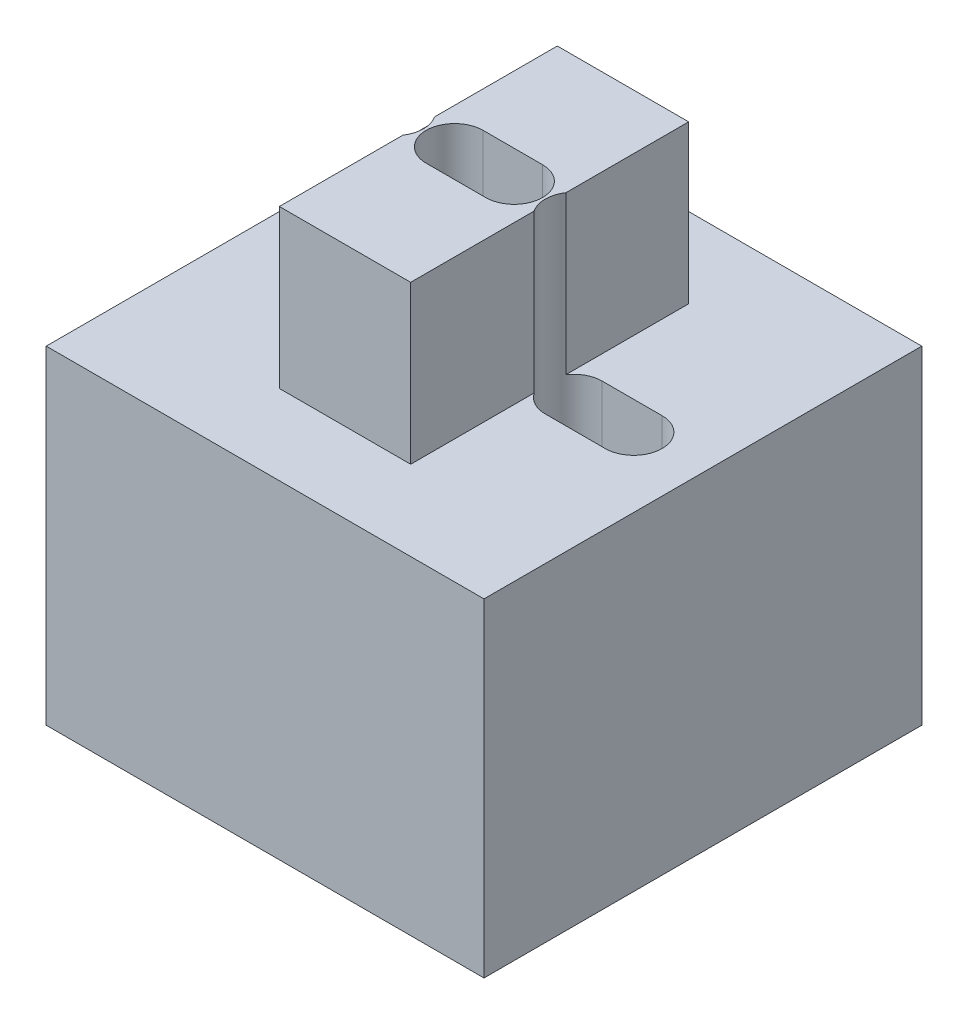
ISO-10303-21;
HEADER;
FILE_DESCRIPTION(('STEP AP214'),'2;1');
FILE_NAME('part.step','',(''),(''),'','','');
FILE_SCHEMA(('AUTOMOTIVE_DESIGN { 1 0 10303 214 1 1 1 1 }'));
ENDSEC;
DATA;
#1=APPLICATION_CONTEXT('core data for automotive mechanical design processes');
#2=APPLICATION_PROTOCOL_DEFINITION('international standard','automotive_design',2000,#1);
#3=PRODUCT_CONTEXT('',#1,'mechanical');
#4=PRODUCT('Part','Part','',(#3));
#5=PRODUCT_RELATED_PRODUCT_CATEGORY('part','',(#4));
#6=PRODUCT_DEFINITION_FORMATION('','',#4);
#7=PRODUCT_DEFINITION_CONTEXT('part definition',#1,'design');
#8=PRODUCT_DEFINITION('design','',#6,#7);
#9=PRODUCT_DEFINITION_SHAPE('','',#8);
#10=(LENGTH_UNIT() NAMED_UNIT(*) SI_UNIT(.MILLI.,.METRE.));
#11=(NAMED_UNIT(*) PLANE_ANGLE_UNIT() SI_UNIT($,.RADIAN.));
#12=(NAMED_UNIT(*) SI_UNIT($,.STERADIAN.) SOLID_ANGLE_UNIT());
#13=UNCERTAINTY_MEASURE_WITH_UNIT(LENGTH_MEASURE(1.E-05),#10,'distance_accuracy_value','');
#14=(GEOMETRIC_REPRESENTATION_CONTEXT(3) GLOBAL_UNCERTAINTY_ASSIGNED_CONTEXT((#13)) GLOBAL_UNIT_ASSIGNED_CONTEXT((#10,
#11,#12)) REPRESENTATION_CONTEXT('',''));
#15=CARTESIAN_POINT('',(0.,0.,0.));
#16=DIRECTION('',(0.,0.,1.));
#17=DIRECTION('',(1.,0.,0.));
#18=AXIS2_PLACEMENT_3D('',#15,#16,#17);
#19=CARTESIAN_POINT('',(-2.18,11.1,-3.16624798998755));
#20=DIRECTION('',(1.,0.,0.));
#21=DIRECTION('',(0.,0.,-1.));
#22=AXIS2_PLACEMENT_3D('',#19,#20,#21);
#23=PLANE('',#22);
#24=DIRECTION('',(0.,0.,1.));
#25=VECTOR('',#24,1.);
#26=CARTESIAN_POINT('',(-2.18,7.5,-3.16624798998755));
#27=LINE('',#26,#25);
#28=CARTESIAN_POINT('',(-2.18,7.5,-3.16624798998755));
#29=VERTEX_POINT('',#28);
#30=CARTESIAN_POINT('',(-2.18,7.5,-0.36180105030251));
#31=VERTEX_POINT('',#30);
#32=EDGE_CURVE('E332',#29,#31,#27,.T.);
#33=ORIENTED_EDGE('',*,*,#32,.T.);
#34=DIRECTION('',(0.,1.,0.));
#35=VECTOR('',#34,1.);
#36=CARTESIAN_POINT('',(-2.18,0.,-0.36180105030251));
#37=LINE('',#36,#35);
#38=CARTESIAN_POINT('',(-2.18,11.1,-0.36180105030251));
#39=VERTEX_POINT('',#38);
#40=EDGE_CURVE('E271',#31,#39,#37,.T.);
#41=ORIENTED_EDGE('',*,*,#40,.T.);
#42=DIRECTION('',(0.,0.,1.));
#43=VECTOR('',#42,1.);
#44=CARTESIAN_POINT('',(-2.18,11.1,-3.16624798998755));
#45=LINE('',#44,#43);
#46=CARTESIAN_POINT('',(-2.18,11.1,-3.16624798998755));
#47=VERTEX_POINT('',#46);
#48=EDGE_CURVE('E319',#47,#39,#45,.T.);
#49=ORIENTED_EDGE('',*,*,#48,.F.);
#50=DIRECTION('',(0.,-1.,0.));
#51=VECTOR('',#50,1.);
#52=CARTESIAN_POINT('',(-2.18,11.1,-3.16624798998755));
#53=LINE('',#52,#51);
#54=EDGE_CURVE('E349',#47,#29,#53,.T.);
#55=ORIENTED_EDGE('',*,*,#54,.T.);
#56=EDGE_LOOP('',(#33,#41,#49,#55));
#57=FACE_BOUND('',#56,.T.);
#58=ADVANCED_FACE('F39',(#57),#23,.F.);
#59=CARTESIAN_POINT('',(0.82,11.1,-3.16624798998755));
#60=DIRECTION('',(-1.,0.,0.));
#61=DIRECTION('',(0.,0.,1.));
#62=AXIS2_PLACEMENT_3D('',#59,#60,#61);
#63=PLANE('',#62);
#64=DIRECTION('',(0.,0.,-1.));
#65=VECTOR('',#64,1.);
#66=CARTESIAN_POINT('',(0.82,7.5,-3.16624798998755));
#67=LINE('',#66,#65);
#68=CARTESIAN_POINT('',(0.82,7.5,3.18277167192382));
#69=VERTEX_POINT('',#68);
#70=CARTESIAN_POINT('',(0.82,7.5,0.361801050302511));
#71=VERTEX_POINT('',#70);
#72=EDGE_CURVE('E318',#69,#71,#67,.T.);
#73=ORIENTED_EDGE('',*,*,#72,.T.);
#74=DIRECTION('',(0.,1.,0.));
#75=VECTOR('',#74,1.);
#76=CARTESIAN_POINT('',(0.82,0.,0.361801050302511));
#77=LINE('',#76,#75);
#78=CARTESIAN_POINT('',(0.82,11.1,0.361801050302511));
#79=VERTEX_POINT('',#78);
#80=EDGE_CURVE('E261',#71,#79,#77,.T.);
#81=ORIENTED_EDGE('',*,*,#80,.T.);
#82=DIRECTION('',(0.,0.,-1.));
#83=VECTOR('',#82,1.);
#84=CARTESIAN_POINT('',(0.82,11.1,-3.16624798998755));
#85=LINE('',#84,#83);
#86=CARTESIAN_POINT('',(0.82,11.1,3.18277167192382));
#87=VERTEX_POINT('',#86);
#88=EDGE_CURVE('E325',#87,#79,#85,.T.);
#89=ORIENTED_EDGE('',*,*,#88,.F.);
#90=DIRECTION('',(0.,-1.,0.));
#91=VECTOR('',#90,1.);
#92=CARTESIAN_POINT('',(0.82,11.1,3.18277167192382));
#93=LINE('',#92,#91);
#94=EDGE_CURVE('E343',#87,#69,#93,.T.);
#95=ORIENTED_EDGE('',*,*,#94,.T.);
#96=EDGE_LOOP('',(#73,#81,#89,#95));
#97=FACE_BOUND('',#96,.T.);
#98=ADVANCED_FACE('F426',(#97),#63,.F.);
#99=CARTESIAN_POINT('',(0.,7.5,0.));
#100=DIRECTION('',(0.,-1.,0.));
#101=DIRECTION('',(0.,0.,-1.));
#102=AXIS2_PLACEMENT_3D('',#99,#100,#101);
#103=PLANE('',#102);
#104=DIRECTION('',(0.,0.,-1.));
#105=VECTOR('',#104,1.);
#106=CARTESIAN_POINT('',(4.32,7.5,5.00826184096814));
#107=LINE('',#106,#105);
#108=CARTESIAN_POINT('',(4.32,7.5,5.00826184096814));
#109=VERTEX_POINT('',#108);
#110=CARTESIAN_POINT('',(4.32,7.5,-4.99173815903186));
#111=VERTEX_POINT('',#110);
#112=EDGE_CURVE('E353',#109,#111,#107,.T.);
#113=ORIENTED_EDGE('',*,*,#112,.T.);
#114=DIRECTION('',(-1.,0.,0.));
#115=VECTOR('',#114,1.);
#116=CARTESIAN_POINT('',(-5.68,7.5,-4.99173815903186));
#117=LINE('',#116,#115);
#118=CARTESIAN_POINT('',(-5.68,7.5,-4.99173815903186));
#119=VERTEX_POINT('',#118);
#120=EDGE_CURVE('E356',#111,#119,#117,.T.);
#121=ORIENTED_EDGE('',*,*,#120,.T.);
#122=DIRECTION('',(0.,0.,1.));
#123=VECTOR('',#122,1.);
#124=CARTESIAN_POINT('',(-5.68,7.5,5.00826184096814));
#125=LINE('',#124,#123);
#126=CARTESIAN_POINT('',(-5.68,7.5,5.00826184096814));
#127=VERTEX_POINT('',#126);
#128=EDGE_CURVE('E359',#119,#127,#125,.T.);
#129=ORIENTED_EDGE('',*,*,#128,.T.);
#130=DIRECTION('',(1.,0.,0.));
#131=VECTOR('',#130,1.);
#132=CARTESIAN_POINT('',(-5.68,7.5,5.00826184096814));
#133=LINE('',#132,#131);
#134=EDGE_CURVE('E361',#127,#109,#133,.T.);
#135=ORIENTED_EDGE('',*,*,#134,.T.);
#136=EDGE_LOOP('',(#113,#121,#129,#135));
#137=FACE_BOUND('',#136,.T.);
#138=DIRECTION('',(1.,0.,0.));
#139=VECTOR('',#138,1.);
#140=CARTESIAN_POINT('',(0.,7.5,-0.65));
#141=LINE('',#140,#139);
#142=CARTESIAN_POINT('',(-4.14643165672213,7.5,-0.65));
#143=VERTEX_POINT('',#142);
#144=CARTESIAN_POINT('',(-2.72,7.5,-0.65));
#145=VERTEX_POINT('',#144);
#146=EDGE_CURVE('E286',#143,#145,#141,.T.);
#147=ORIENTED_EDGE('',*,*,#146,.T.);
#148=CARTESIAN_POINT('',(-2.72,7.5,0.));
#149=DIRECTION('',(0.,-1.,0.));
#150=DIRECTION('',(0.,0.,-1.));
#151=AXIS2_PLACEMENT_3D('',#148,#149,#150);
#152=CIRCLE('',#151,0.65);
#153=EDGE_CURVE('E272',#145,#31,#152,.T.);
#154=ORIENTED_EDGE('',*,*,#153,.T.);
#155=ORIENTED_EDGE('',*,*,#32,.F.);
#156=DIRECTION('',(-1.,0.,0.));
#157=VECTOR('',#156,1.);
#158=CARTESIAN_POINT('',(-2.18,7.5,-3.16624798998755));
#159=LINE('',#158,#157);
#160=CARTESIAN_POINT('',(0.82,7.5,-3.16624798998755));
#161=VERTEX_POINT('',#160);
#162=EDGE_CURVE('E310',#161,#29,#159,.T.);
#163=ORIENTED_EDGE('',*,*,#162,.F.);
#164=CARTESIAN_POINT('',(0.82,7.5,-0.361801050302511));
#165=VERTEX_POINT('',#164);
#166=EDGE_CURVE('E338',#165,#161,#67,.T.);
#167=ORIENTED_EDGE('',*,*,#166,.F.);
#168=CARTESIAN_POINT('',(1.36,7.5,0.));
#169=DIRECTION('',(0.,-1.,0.));
#170=DIRECTION('',(0.,0.,-1.));
#171=AXIS2_PLACEMENT_3D('',#168,#169,#170);
#172=CIRCLE('',#171,0.65);
#173=CARTESIAN_POINT('',(1.36,7.5,-0.65));
#174=VERTEX_POINT('',#173);
#175=EDGE_CURVE('E258',#165,#174,#172,.T.);
#176=ORIENTED_EDGE('',*,*,#175,.T.);
#177=DIRECTION('',(1.,0.,0.));
#178=VECTOR('',#177,1.);
#179=CARTESIAN_POINT('',(0.,7.5,-0.65));
#180=LINE('',#179,#178);
#181=CARTESIAN_POINT('',(2.73028057354652,7.5,-0.65));
#182=VERTEX_POINT('',#181);
#183=EDGE_CURVE('E275',#174,#182,#180,.T.);
#184=ORIENTED_EDGE('',*,*,#183,.T.);
#185=CARTESIAN_POINT('',(2.73028057354652,7.5,0.));
#186=DIRECTION('',(0.,-1.,0.));
#187=DIRECTION('',(0.,0.,-1.));
#188=AXIS2_PLACEMENT_3D('',#185,#186,#187);
#189=CIRCLE('',#188,0.65);
#190=CARTESIAN_POINT('',(2.73028057354652,7.5,0.65));
#191=VERTEX_POINT('',#190);
#192=EDGE_CURVE('E281',#182,#191,#189,.T.);
#193=ORIENTED_EDGE('',*,*,#192,.T.);
#194=DIRECTION('',(-1.,0.,0.));
#195=VECTOR('',#194,1.);
#196=CARTESIAN_POINT('',(0.,7.5,0.65));
#197=LINE('',#196,#195);
#198=CARTESIAN_POINT('',(1.36,7.5,0.65));
#199=VERTEX_POINT('',#198);
#200=EDGE_CURVE('E278',#191,#199,#197,.T.);
#201=ORIENTED_EDGE('',*,*,#200,.T.);
#202=EDGE_CURVE('E262',#199,#71,#172,.T.);
#203=ORIENTED_EDGE('',*,*,#202,.T.);
#204=ORIENTED_EDGE('',*,*,#72,.F.);
#205=DIRECTION('',(1.,0.,0.));
#206=VECTOR('',#205,1.);
#207=CARTESIAN_POINT('',(0.82,7.5,3.18277167192382));
#208=LINE('',#207,#206);
#209=CARTESIAN_POINT('',(-2.18,7.5,3.18277167192382));
#210=VERTEX_POINT('',#209);
#211=EDGE_CURVE('E335',#210,#69,#208,.T.);
#212=ORIENTED_EDGE('',*,*,#211,.F.);
#213=CARTESIAN_POINT('',(-2.18,7.5,0.36180105030251));
#214=VERTEX_POINT('',#213);
#215=EDGE_CURVE('E331',#214,#210,#27,.T.);
#216=ORIENTED_EDGE('',*,*,#215,.F.);
#217=CARTESIAN_POINT('',(-2.72,7.5,0.65));
#218=VERTEX_POINT('',#217);
#219=EDGE_CURVE('E268',#214,#218,#152,.T.);
#220=ORIENTED_EDGE('',*,*,#219,.T.);
#221=DIRECTION('',(-1.,0.,0.));
#222=VECTOR('',#221,1.);
#223=CARTESIAN_POINT('',(0.,7.5,0.65));
#224=LINE('',#223,#222);
#225=CARTESIAN_POINT('',(-4.14643165672213,7.5,0.65));
#226=VERTEX_POINT('',#225);
#227=EDGE_CURVE('E284',#218,#226,#224,.T.);
#228=ORIENTED_EDGE('',*,*,#227,.T.);
#229=CARTESIAN_POINT('',(-4.14643165672213,7.5,0.));
#230=DIRECTION('',(0.,-1.,0.));
#231=DIRECTION('',(0.,0.,-1.));
#232=AXIS2_PLACEMENT_3D('',#229,#230,#231);
#233=CIRCLE('',#232,0.65);
#234=EDGE_CURVE('E210',#226,#143,#233,.T.);
#235=ORIENTED_EDGE('',*,*,#234,.T.);
#236=EDGE_LOOP('',(#147,#154,#155,#163,#167,#176,#184,#193,#201,#203,#204,#212,#216,#220,#228,#235));
#237=FACE_BOUND('',#236,.T.);
#238=ADVANCED_FACE('F412',(#137,#237),#103,.F.);
#239=CARTESIAN_POINT('',(4.32,7.5,5.00826184096814));
#240=DIRECTION('',(-1.,0.,0.));
#241=DIRECTION('',(0.,0.,1.));
#242=AXIS2_PLACEMENT_3D('',#239,#240,#241);
#243=PLANE('',#242);
#244=DIRECTION('',(0.,0.,-1.));
#245=VECTOR('',#244,1.);
#246=CARTESIAN_POINT('',(4.32,0.,5.00826184096814));
#247=LINE('',#246,#245);
#248=CARTESIAN_POINT('',(4.32,0.,5.00826184096814));
#249=VERTEX_POINT('',#248);
#250=CARTESIAN_POINT('',(4.32,0.,-4.99173815903186));
#251=VERTEX_POINT('',#250);
#252=EDGE_CURVE('E352',#249,#251,#247,.T.);
#253=ORIENTED_EDGE('',*,*,#252,.T.);
#254=DIRECTION('',(0.,-1.,0.));
#255=VECTOR('',#254,1.);
#256=CARTESIAN_POINT('',(4.32,7.5,-4.99173815903186));
#257=LINE('',#256,#255);
#258=EDGE_CURVE('E379',#111,#251,#257,.T.);
#259=ORIENTED_EDGE('',*,*,#258,.F.);
#260=ORIENTED_EDGE('',*,*,#112,.F.);
#261=DIRECTION('',(0.,-1.,0.));
#262=VECTOR('',#261,1.);
#263=CARTESIAN_POINT('',(4.32,7.5,5.00826184096814));
#264=LINE('',#263,#262);
#265=EDGE_CURVE('E363',#109,#249,#264,.T.);
#266=ORIENTED_EDGE('',*,*,#265,.T.);
#267=EDGE_LOOP('',(#253,#259,#260,#266));
#268=FACE_BOUND('',#267,.T.);
#269=ADVANCED_FACE('F41',(#268),#243,.F.);
#270=CARTESIAN_POINT('',(-5.68,7.5,-4.99173815903186));
#271=DIRECTION('',(0.,0.,1.));
#272=DIRECTION('',(1.,0.,0.));
#273=AXIS2_PLACEMENT_3D('',#270,#271,#272);
#274=PLANE('',#273);
#275=DIRECTION('',(-1.,0.,0.));
#276=VECTOR('',#275,1.);
#277=CARTESIAN_POINT('',(-5.68,0.,-4.99173815903186));
#278=LINE('',#277,#276);
#279=CARTESIAN_POINT('',(-5.68,0.,-4.99173815903186));
#280=VERTEX_POINT('',#279);
#281=EDGE_CURVE('E366',#251,#280,#278,.T.);
#282=ORIENTED_EDGE('',*,*,#281,.T.);
#283=DIRECTION('',(0.,-1.,0.));
#284=VECTOR('',#283,1.);
#285=CARTESIAN_POINT('',(-5.68,7.5,-4.99173815903186));
#286=LINE('',#285,#284);
#287=EDGE_CURVE('E376',#119,#280,#286,.T.);
#288=ORIENTED_EDGE('',*,*,#287,.F.);
#289=ORIENTED_EDGE('',*,*,#120,.F.);
#290=ORIENTED_EDGE('',*,*,#258,.T.);
#291=EDGE_LOOP('',(#282,#288,#289,#290));
#292=FACE_BOUND('',#291,.T.);
#293=ADVANCED_FACE('F664',(#292),#274,.F.);
#294=CARTESIAN_POINT('',(-5.68,7.5,5.00826184096814));
#295=DIRECTION('',(1.,0.,0.));
#296=DIRECTION('',(0.,0.,-1.));
#297=AXIS2_PLACEMENT_3D('',#294,#295,#296);
#298=PLANE('',#297);
#299=DIRECTION('',(0.,0.,1.));
#300=VECTOR('',#299,1.);
#301=CARTESIAN_POINT('',(-5.68,0.,5.00826184096814));
#302=LINE('',#301,#300);
#303=CARTESIAN_POINT('',(-5.68,0.,5.00826184096814));
#304=VERTEX_POINT('',#303);
#305=EDGE_CURVE('E368',#280,#304,#302,.T.);
#306=ORIENTED_EDGE('',*,*,#305,.T.);
#307=DIRECTION('',(0.,-1.,0.));
#308=VECTOR('',#307,1.);
#309=CARTESIAN_POINT('',(-5.68,7.5,5.00826184096814));
#310=LINE('',#309,#308);
#311=EDGE_CURVE('E373',#127,#304,#310,.T.);
#312=ORIENTED_EDGE('',*,*,#311,.F.);
#313=ORIENTED_EDGE('',*,*,#128,.F.);
#314=ORIENTED_EDGE('',*,*,#287,.T.);
#315=EDGE_LOOP('',(#306,#312,#313,#314));
#316=FACE_BOUND('',#315,.T.);
#317=ADVANCED_FACE('F654',(#316),#298,.F.);
#318=CARTESIAN_POINT('',(-5.68,7.5,5.00826184096814));
#319=DIRECTION('',(0.,0.,-1.));
#320=DIRECTION('',(-1.,0.,0.));
#321=AXIS2_PLACEMENT_3D('',#318,#319,#320);
#322=PLANE('',#321);
#323=DIRECTION('',(1.,0.,0.));
#324=VECTOR('',#323,1.);
#325=CARTESIAN_POINT('',(-5.68,0.,5.00826184096814));
#326=LINE('',#325,#324);
#327=EDGE_CURVE('E357',#304,#249,#326,.T.);
#328=ORIENTED_EDGE('',*,*,#327,.T.);
#329=ORIENTED_EDGE('',*,*,#265,.F.);
#330=ORIENTED_EDGE('',*,*,#134,.F.);
#331=ORIENTED_EDGE('',*,*,#311,.T.);
#332=EDGE_LOOP('',(#328,#329,#330,#331));
#333=FACE_BOUND('',#332,.T.);
#334=ADVANCED_FACE('F646',(#333),#322,.F.);
#335=CARTESIAN_POINT('',(0.,0.,0.));
#336=DIRECTION('',(0.,-1.,0.));
#337=DIRECTION('',(0.,0.,-1.));
#338=AXIS2_PLACEMENT_3D('',#335,#336,#337);
#339=PLANE('',#338);
#340=CARTESIAN_POINT('',(-4.14643165672213,0.,0.));
#341=DIRECTION('',(0.,1.,0.));
#342=DIRECTION('',(0.,0.,1.));
#343=AXIS2_PLACEMENT_3D('',#340,#341,#342);
#344=CIRCLE('',#343,0.65);
#345=CARTESIAN_POINT('',(-4.14643165672213,0.,-0.65));
#346=VERTEX_POINT('',#345);
#347=CARTESIAN_POINT('',(-4.14643165672213,0.,0.65));
#348=VERTEX_POINT('',#347);
#349=EDGE_CURVE('E207',#346,#348,#344,.T.);
#350=ORIENTED_EDGE('',*,*,#349,.T.);
#351=DIRECTION('',(1.,0.,0.));
#352=VECTOR('',#351,1.);
#353=CARTESIAN_POINT('',(-4.14643165672213,0.,0.65));
#354=LINE('',#353,#352);
#355=CARTESIAN_POINT('',(-2.72,0.,0.65));
#356=VERTEX_POINT('',#355);
#357=EDGE_CURVE('E217',#348,#356,#354,.T.);
#358=ORIENTED_EDGE('',*,*,#357,.T.);
#359=CARTESIAN_POINT('',(-2.72,0.,0.));
#360=DIRECTION('',(0.,1.,0.));
#361=DIRECTION('',(0.,0.,1.));
#362=AXIS2_PLACEMENT_3D('',#359,#360,#361);
#363=CIRCLE('',#362,0.65);
#364=CARTESIAN_POINT('',(-2.72,0.,-0.65));
#365=VERTEX_POINT('',#364);
#366=EDGE_CURVE('E54',#356,#365,#363,.T.);
#367=ORIENTED_EDGE('',*,*,#366,.T.);
#368=DIRECTION('',(-1.,0.,0.));
#369=VECTOR('',#368,1.);
#370=CARTESIAN_POINT('',(-4.14643165672213,0.,-0.65));
#371=LINE('',#370,#369);
#372=EDGE_CURVE('E214',#365,#346,#371,.T.);
#373=ORIENTED_EDGE('',*,*,#372,.T.);
#374=EDGE_LOOP('',(#350,#358,#367,#373));
#375=FACE_BOUND('',#374,.T.);
#376=CARTESIAN_POINT('',(2.73028057354652,0.,0.));
#377=DIRECTION('',(0.,1.,0.));
#378=DIRECTION('',(0.,0.,1.));
#379=AXIS2_PLACEMENT_3D('',#376,#377,#378);
#380=CIRCLE('',#379,0.65);
#381=CARTESIAN_POINT('',(2.73028057354652,0.,0.65));
#382=VERTEX_POINT('',#381);
#383=CARTESIAN_POINT('',(2.73028057354652,0.,-0.65));
#384=VERTEX_POINT('',#383);
#385=EDGE_CURVE('E224',#382,#384,#380,.T.);
#386=ORIENTED_EDGE('',*,*,#385,.T.);
#387=DIRECTION('',(-1.,0.,0.));
#388=VECTOR('',#387,1.);
#389=CARTESIAN_POINT('',(2.73028057354652,0.,-0.65));
#390=LINE('',#389,#388);
#391=CARTESIAN_POINT('',(1.36,0.,-0.65));
#392=VERTEX_POINT('',#391);
#393=EDGE_CURVE('E227',#384,#392,#390,.T.);
#394=ORIENTED_EDGE('',*,*,#393,.T.);
#395=CARTESIAN_POINT('',(1.36,0.,0.));
#396=DIRECTION('',(0.,1.,0.));
#397=DIRECTION('',(0.,0.,1.));
#398=AXIS2_PLACEMENT_3D('',#395,#396,#397);
#399=CIRCLE('',#398,0.65);
#400=CARTESIAN_POINT('',(1.36,0.,0.65));
#401=VERTEX_POINT('',#400);
#402=EDGE_CURVE('E62',#392,#401,#399,.T.);
#403=ORIENTED_EDGE('',*,*,#402,.T.);
#404=DIRECTION('',(1.,0.,0.));
#405=VECTOR('',#404,1.);
#406=CARTESIAN_POINT('',(2.73028057354652,0.,0.65));
#407=LINE('',#406,#405);
#408=EDGE_CURVE('E242',#401,#382,#407,.T.);
#409=ORIENTED_EDGE('',*,*,#408,.T.);
#410=EDGE_LOOP('',(#386,#394,#403,#409));
#411=FACE_BOUND('',#410,.T.);
#412=CARTESIAN_POINT('',(-1.36,0.,0.));
#413=DIRECTION('',(0.,1.,0.));
#414=DIRECTION('',(0.,0.,1.));
#415=AXIS2_PLACEMENT_3D('',#412,#413,#414);
#416=CIRCLE('',#415,0.65);
#417=CARTESIAN_POINT('',(-1.36,0.,-0.65));
#418=VERTEX_POINT('',#417);
#419=CARTESIAN_POINT('',(-1.36,0.,0.65));
#420=VERTEX_POINT('',#419);
#421=EDGE_CURVE('E290',#418,#420,#416,.T.);
#422=ORIENTED_EDGE('',*,*,#421,.T.);
#423=DIRECTION('',(1.,0.,0.));
#424=VECTOR('',#423,1.);
#425=CARTESIAN_POINT('',(0.,0.,0.65));
#426=LINE('',#425,#424);
#427=CARTESIAN_POINT('',(0.,0.,0.65));
#428=VERTEX_POINT('',#427);
#429=EDGE_CURVE('E293',#420,#428,#426,.T.);
#430=ORIENTED_EDGE('',*,*,#429,.T.);
#431=CARTESIAN_POINT('',(0.,0.,0.));
#432=DIRECTION('',(0.,1.,0.));
#433=DIRECTION('',(0.,0.,1.));
#434=AXIS2_PLACEMENT_3D('',#431,#432,#433);
#435=CIRCLE('',#434,0.65);
#436=CARTESIAN_POINT('',(0.,0.,-0.65));
#437=VERTEX_POINT('',#436);
#438=EDGE_CURVE('E296',#428,#437,#435,.T.);
#439=ORIENTED_EDGE('',*,*,#438,.T.);
#440=DIRECTION('',(-1.,0.,0.));
#441=VECTOR('',#440,1.);
#442=CARTESIAN_POINT('',(-1.36,0.,-0.65));
#443=LINE('',#442,#441);
#444=EDGE_CURVE('E299',#437,#418,#443,.T.);
#445=ORIENTED_EDGE('',*,*,#444,.T.);
#446=EDGE_LOOP('',(#422,#430,#439,#445));
#447=FACE_BOUND('',#446,.T.);
#448=ORIENTED_EDGE('',*,*,#252,.F.);
#449=ORIENTED_EDGE('',*,*,#327,.F.);
#450=ORIENTED_EDGE('',*,*,#305,.F.);
#451=ORIENTED_EDGE('',*,*,#281,.F.);
#452=EDGE_LOOP('',(#448,#449,#450,#451));
#453=FACE_BOUND('',#452,.T.);
#454=ADVANCED_FACE('F221',(#375,#411,#447,#453),#339,.T.);
#455=CARTESIAN_POINT('',(-2.18,11.1,-3.16624798998755));
#456=DIRECTION('',(0.,0.,1.));
#457=DIRECTION('',(1.,0.,0.));
#458=AXIS2_PLACEMENT_3D('',#455,#456,#457);
#459=PLANE('',#458);
#460=ORIENTED_EDGE('',*,*,#162,.T.);
#461=ORIENTED_EDGE('',*,*,#54,.F.);
#462=DIRECTION('',(-1.,0.,0.));
#463=VECTOR('',#462,1.);
#464=CARTESIAN_POINT('',(-2.18,11.1,-3.16624798998755));
#465=LINE('',#464,#463);
#466=CARTESIAN_POINT('',(0.82,11.1,-3.16624798998755));
#467=VERTEX_POINT('',#466);
#468=EDGE_CURVE('E314',#467,#47,#465,.T.);
#469=ORIENTED_EDGE('',*,*,#468,.F.);
#470=DIRECTION('',(0.,-1.,0.));
#471=VECTOR('',#470,1.);
#472=CARTESIAN_POINT('',(0.82,11.1,-3.16624798998755));
#473=LINE('',#472,#471);
#474=EDGE_CURVE('E328',#467,#161,#473,.T.);
#475=ORIENTED_EDGE('',*,*,#474,.T.);
#476=EDGE_LOOP('',(#460,#461,#469,#475));
#477=FACE_BOUND('',#476,.T.);
#478=ADVANCED_FACE('F406',(#477),#459,.F.);
#479=CARTESIAN_POINT('',(-2.18,11.1,0.36180105030251));
#480=VERTEX_POINT('',#479);
#481=CARTESIAN_POINT('',(-2.18,11.1,3.18277167192382));
#482=VERTEX_POINT('',#481);
#483=EDGE_CURVE('E317',#480,#482,#45,.T.);
#484=ORIENTED_EDGE('',*,*,#483,.F.);
#485=DIRECTION('',(0.,1.,0.));
#486=VECTOR('',#485,1.);
#487=CARTESIAN_POINT('',(-2.18,0.,0.36180105030251));
#488=LINE('',#487,#486);
#489=EDGE_CURVE('E265',#480,#214,#488,.F.);
#490=ORIENTED_EDGE('',*,*,#489,.T.);
#491=ORIENTED_EDGE('',*,*,#215,.T.);
#492=DIRECTION('',(0.,-1.,0.));
#493=VECTOR('',#492,1.);
#494=CARTESIAN_POINT('',(-2.18,11.1,3.18277167192382));
#495=LINE('',#494,#493);
#496=EDGE_CURVE('E346',#482,#210,#495,.T.);
#497=ORIENTED_EDGE('',*,*,#496,.F.);
#498=EDGE_LOOP('',(#484,#490,#491,#497));
#499=FACE_BOUND('',#498,.T.);
#500=ADVANCED_FACE('F428',(#499),#23,.F.);
#501=CARTESIAN_POINT('',(0.82,11.1,3.18277167192382));
#502=DIRECTION('',(0.,0.,-1.));
#503=DIRECTION('',(-1.,0.,0.));
#504=AXIS2_PLACEMENT_3D('',#501,#502,#503);
#505=PLANE('',#504);
#506=ORIENTED_EDGE('',*,*,#211,.T.);
#507=ORIENTED_EDGE('',*,*,#94,.F.);
#508=DIRECTION('',(1.,0.,0.));
#509=VECTOR('',#508,1.);
#510=CARTESIAN_POINT('',(0.82,11.1,3.18277167192382));
#511=LINE('',#510,#509);
#512=EDGE_CURVE('E322',#482,#87,#511,.T.);
#513=ORIENTED_EDGE('',*,*,#512,.F.);
#514=ORIENTED_EDGE('',*,*,#496,.T.);
#515=EDGE_LOOP('',(#506,#507,#513,#514));
#516=FACE_BOUND('',#515,.T.);
#517=ADVANCED_FACE('F437',(#516),#505,.F.);
#518=CARTESIAN_POINT('',(0.82,11.1,-0.361801050302511));
#519=VERTEX_POINT('',#518);
#520=EDGE_CURVE('E324',#519,#467,#85,.T.);
#521=ORIENTED_EDGE('',*,*,#520,.F.);
#522=DIRECTION('',(0.,1.,0.));
#523=VECTOR('',#522,1.);
#524=CARTESIAN_POINT('',(0.82,0.,-0.361801050302511));
#525=LINE('',#524,#523);
#526=EDGE_CURVE('E234',#519,#165,#525,.F.);
#527=ORIENTED_EDGE('',*,*,#526,.T.);
#528=ORIENTED_EDGE('',*,*,#166,.T.);
#529=ORIENTED_EDGE('',*,*,#474,.F.);
#530=EDGE_LOOP('',(#521,#527,#528,#529));
#531=FACE_BOUND('',#530,.T.);
#532=ADVANCED_FACE('F400',(#531),#63,.F.);
#533=CARTESIAN_POINT('',(0.,11.1,0.));
#534=DIRECTION('',(0.,-1.,0.));
#535=DIRECTION('',(0.,0.,-1.));
#536=AXIS2_PLACEMENT_3D('',#533,#534,#535);
#537=PLANE('',#536);
#538=DIRECTION('',(1.,0.,0.));
#539=VECTOR('',#538,1.);
#540=CARTESIAN_POINT('',(0.,11.1,0.65));
#541=LINE('',#540,#539);
#542=CARTESIAN_POINT('',(0.,11.1,0.65));
#543=VERTEX_POINT('',#542);
#544=CARTESIAN_POINT('',(-1.36,11.1,0.65));
#545=VERTEX_POINT('',#544);
#546=EDGE_CURVE('E382',#543,#545,#541,.F.);
#547=ORIENTED_EDGE('',*,*,#546,.T.);
#548=CARTESIAN_POINT('',(-1.36,11.1,0.));
#549=DIRECTION('',(0.,1.,0.));
#550=DIRECTION('',(0.,0.,1.));
#551=AXIS2_PLACEMENT_3D('',#548,#549,#550);
#552=CIRCLE('',#551,0.65);
#553=CARTESIAN_POINT('',(-1.36,11.1,-0.65));
#554=VERTEX_POINT('',#553);
#555=EDGE_CURVE('E391',#545,#554,#552,.F.);
#556=ORIENTED_EDGE('',*,*,#555,.T.);
#557=DIRECTION('',(1.,0.,0.));
#558=VECTOR('',#557,1.);
#559=CARTESIAN_POINT('',(0.,11.1,-0.65));
#560=LINE('',#559,#558);
#561=CARTESIAN_POINT('',(0.,11.1,-0.65));
#562=VERTEX_POINT('',#561);
#563=EDGE_CURVE('E388',#554,#562,#560,.T.);
#564=ORIENTED_EDGE('',*,*,#563,.T.);
#565=CARTESIAN_POINT('',(0.,11.1,0.));
#566=DIRECTION('',(0.,1.,0.));
#567=DIRECTION('',(0.,0.,1.));
#568=AXIS2_PLACEMENT_3D('',#565,#566,#567);
#569=CIRCLE('',#568,0.65);
#570=EDGE_CURVE('E385',#562,#543,#569,.F.);
#571=ORIENTED_EDGE('',*,*,#570,.T.);
#572=EDGE_LOOP('',(#547,#556,#564,#571));
#573=FACE_BOUND('',#572,.T.);
#574=ORIENTED_EDGE('',*,*,#48,.T.);
#575=CARTESIAN_POINT('',(-2.72,11.1,0.));
#576=DIRECTION('',(0.,-1.,0.));
#577=DIRECTION('',(0.,0.,-1.));
#578=AXIS2_PLACEMENT_3D('',#575,#576,#577);
#579=CIRCLE('',#578,0.65);
#580=EDGE_CURVE('E11',#39,#480,#579,.T.);
#581=ORIENTED_EDGE('',*,*,#580,.T.);
#582=ORIENTED_EDGE('',*,*,#483,.T.);
#583=ORIENTED_EDGE('',*,*,#512,.T.);
#584=ORIENTED_EDGE('',*,*,#88,.T.);
#585=CARTESIAN_POINT('',(1.36,11.1,0.));
#586=DIRECTION('',(0.,-1.,0.));
#587=DIRECTION('',(0.,0.,-1.));
#588=AXIS2_PLACEMENT_3D('',#585,#586,#587);
#589=CIRCLE('',#588,0.65);
#590=EDGE_CURVE('E47',#79,#519,#589,.T.);
#591=ORIENTED_EDGE('',*,*,#590,.T.);
#592=ORIENTED_EDGE('',*,*,#520,.T.);
#593=ORIENTED_EDGE('',*,*,#468,.T.);
#594=EDGE_LOOP('',(#574,#581,#582,#583,#584,#591,#592,#593));
#595=FACE_BOUND('',#594,.T.);
#596=ADVANCED_FACE('F396',(#573,#595),#537,.F.);
#597=CARTESIAN_POINT('',(-1.36,0.,0.));
#598=DIRECTION('',(0.,1.,0.));
#599=DIRECTION('',(0.,0.,1.));
#600=AXIS2_PLACEMENT_3D('',#597,#598,#599);
#601=CYLINDRICAL_SURFACE('',#600,0.65);
#602=DIRECTION('',(0.,1.,0.));
#603=VECTOR('',#602,1.);
#604=CARTESIAN_POINT('',(-1.36,0.,0.65));
#605=LINE('',#604,#603);
#606=EDGE_CURVE('E302',#420,#545,#605,.T.);
#607=ORIENTED_EDGE('',*,*,#606,.F.);
#608=ORIENTED_EDGE('',*,*,#421,.F.);
#609=DIRECTION('',(0.,1.,0.));
#610=VECTOR('',#609,1.);
#611=CARTESIAN_POINT('',(-1.36,0.,-0.65));
#612=LINE('',#611,#610);
#613=EDGE_CURVE('E306',#418,#554,#612,.T.);
#614=ORIENTED_EDGE('',*,*,#613,.T.);
#615=ORIENTED_EDGE('',*,*,#555,.F.);
#616=EDGE_LOOP('',(#607,#608,#614,#615));
#617=FACE_BOUND('',#616,.T.);
#618=ADVANCED_FACE('F474',(#617),#601,.F.);
#619=CARTESIAN_POINT('',(-1.36,0.,-0.65));
#620=DIRECTION('',(0.,0.,-1.));
#621=DIRECTION('',(-1.,0.,0.));
#622=AXIS2_PLACEMENT_3D('',#619,#620,#621);
#623=PLANE('',#622);
#624=ORIENTED_EDGE('',*,*,#613,.F.);
#625=ORIENTED_EDGE('',*,*,#444,.F.);
#626=DIRECTION('',(0.,1.,0.));
#627=VECTOR('',#626,1.);
#628=CARTESIAN_POINT('',(0.,0.,-0.65));
#629=LINE('',#628,#627);
#630=EDGE_CURVE('E303',#437,#562,#629,.T.);
#631=ORIENTED_EDGE('',*,*,#630,.T.);
#632=ORIENTED_EDGE('',*,*,#563,.F.);
#633=EDGE_LOOP('',(#624,#625,#631,#632));
#634=FACE_BOUND('',#633,.T.);
#635=ADVANCED_FACE('F470',(#634),#623,.F.);
#636=CARTESIAN_POINT('',(0.,0.,0.));
#637=DIRECTION('',(0.,1.,0.));
#638=DIRECTION('',(0.,0.,1.));
#639=AXIS2_PLACEMENT_3D('',#636,#637,#638);
#640=CYLINDRICAL_SURFACE('',#639,0.65);
#641=ORIENTED_EDGE('',*,*,#630,.F.);
#642=ORIENTED_EDGE('',*,*,#438,.F.);
#643=DIRECTION('',(0.,1.,0.));
#644=VECTOR('',#643,1.);
#645=CARTESIAN_POINT('',(0.,0.,0.65));
#646=LINE('',#645,#644);
#647=EDGE_CURVE('E307',#428,#543,#646,.T.);
#648=ORIENTED_EDGE('',*,*,#647,.T.);
#649=ORIENTED_EDGE('',*,*,#570,.F.);
#650=EDGE_LOOP('',(#641,#642,#648,#649));
#651=FACE_BOUND('',#650,.T.);
#652=ADVANCED_FACE('F473',(#651),#640,.F.);
#653=CARTESIAN_POINT('',(0.,0.,0.65));
#654=DIRECTION('',(0.,0.,1.));
#655=DIRECTION('',(1.,0.,0.));
#656=AXIS2_PLACEMENT_3D('',#653,#654,#655);
#657=PLANE('',#656);
#658=ORIENTED_EDGE('',*,*,#647,.F.);
#659=ORIENTED_EDGE('',*,*,#429,.F.);
#660=ORIENTED_EDGE('',*,*,#606,.T.);
#661=ORIENTED_EDGE('',*,*,#546,.F.);
#662=EDGE_LOOP('',(#658,#659,#660,#661));
#663=FACE_BOUND('',#662,.T.);
#664=ADVANCED_FACE('F478',(#663),#657,.F.);
#665=CARTESIAN_POINT('',(2.73028057354652,0.,0.));
#666=DIRECTION('',(0.,1.,0.));
#667=DIRECTION('',(0.,0.,1.));
#668=AXIS2_PLACEMENT_3D('',#665,#666,#667);
#669=CYLINDRICAL_SURFACE('',#668,0.65);
#670=DIRECTION('',(0.,1.,0.));
#671=VECTOR('',#670,1.);
#672=CARTESIAN_POINT('',(2.73028057354652,0.,-0.65));
#673=LINE('',#672,#671);
#674=EDGE_CURVE('E239',#384,#182,#673,.T.);
#675=ORIENTED_EDGE('',*,*,#674,.F.);
#676=ORIENTED_EDGE('',*,*,#385,.F.);
#677=DIRECTION('',(0.,1.,0.));
#678=VECTOR('',#677,1.);
#679=CARTESIAN_POINT('',(2.73028057354652,0.,0.65));
#680=LINE('',#679,#678);
#681=EDGE_CURVE('E248',#382,#191,#680,.T.);
#682=ORIENTED_EDGE('',*,*,#681,.T.);
#683=ORIENTED_EDGE('',*,*,#192,.F.);
#684=EDGE_LOOP('',(#675,#676,#682,#683));
#685=FACE_BOUND('',#684,.T.);
#686=ADVANCED_FACE('F455',(#685),#669,.F.);
#687=CARTESIAN_POINT('',(2.73028057354652,0.,0.65));
#688=DIRECTION('',(0.,0.,1.));
#689=DIRECTION('',(1.,0.,0.));
#690=AXIS2_PLACEMENT_3D('',#687,#688,#689);
#691=PLANE('',#690);
#692=ORIENTED_EDGE('',*,*,#681,.F.);
#693=ORIENTED_EDGE('',*,*,#408,.F.);
#694=DIRECTION('',(0.,1.,0.));
#695=VECTOR('',#694,1.);
#696=CARTESIAN_POINT('',(1.36,0.,0.65));
#697=LINE('',#696,#695);
#698=EDGE_CURVE('E245',#401,#199,#697,.T.);
#699=ORIENTED_EDGE('',*,*,#698,.T.);
#700=ORIENTED_EDGE('',*,*,#200,.F.);
#701=EDGE_LOOP('',(#692,#693,#699,#700));
#702=FACE_BOUND('',#701,.T.);
#703=ADVANCED_FACE('F451',(#702),#691,.F.);
#704=CARTESIAN_POINT('',(2.73028057354652,0.,-0.65));
#705=DIRECTION('',(0.,0.,-1.));
#706=DIRECTION('',(-1.,0.,0.));
#707=AXIS2_PLACEMENT_3D('',#704,#705,#706);
#708=PLANE('',#707);
#709=DIRECTION('',(0.,1.,0.));
#710=VECTOR('',#709,1.);
#711=CARTESIAN_POINT('',(1.36,0.,-0.65));
#712=LINE('',#711,#710);
#713=EDGE_CURVE('E243',#392,#174,#712,.T.);
#714=ORIENTED_EDGE('',*,*,#713,.F.);
#715=ORIENTED_EDGE('',*,*,#393,.F.);
#716=ORIENTED_EDGE('',*,*,#674,.T.);
#717=ORIENTED_EDGE('',*,*,#183,.F.);
#718=EDGE_LOOP('',(#714,#715,#716,#717));
#719=FACE_BOUND('',#718,.T.);
#720=ADVANCED_FACE('F459',(#719),#708,.F.);
#721=CARTESIAN_POINT('',(1.36,0.,0.));
#722=DIRECTION('',(0.,1.,0.));
#723=DIRECTION('',(0.,0.,1.));
#724=AXIS2_PLACEMENT_3D('',#721,#722,#723);
#725=CYLINDRICAL_SURFACE('',#724,0.65);
#726=ORIENTED_EDGE('',*,*,#698,.F.);
#727=ORIENTED_EDGE('',*,*,#402,.F.);
#728=ORIENTED_EDGE('',*,*,#713,.T.);
#729=ORIENTED_EDGE('',*,*,#175,.F.);
#730=ORIENTED_EDGE('',*,*,#526,.F.);
#731=ORIENTED_EDGE('',*,*,#590,.F.);
#732=ORIENTED_EDGE('',*,*,#80,.F.);
#733=ORIENTED_EDGE('',*,*,#202,.F.);
#734=EDGE_LOOP('',(#726,#727,#728,#729,#730,#731,#732,#733));
#735=FACE_BOUND('',#734,.T.);
#736=ADVANCED_FACE('F422',(#735),#725,.F.);
#737=CARTESIAN_POINT('',(-4.14643165672213,0.,0.));
#738=DIRECTION('',(0.,1.,0.));
#739=DIRECTION('',(0.,0.,1.));
#740=AXIS2_PLACEMENT_3D('',#737,#738,#739);
#741=CYLINDRICAL_SURFACE('',#740,0.65);
#742=DIRECTION('',(0.,1.,0.));
#743=VECTOR('',#742,1.);
#744=CARTESIAN_POINT('',(-4.14643165672213,0.,0.65));
#745=LINE('',#744,#743);
#746=EDGE_CURVE('E202',#348,#226,#745,.T.);
#747=ORIENTED_EDGE('',*,*,#746,.F.);
#748=ORIENTED_EDGE('',*,*,#349,.F.);
#749=DIRECTION('',(0.,1.,0.));
#750=VECTOR('',#749,1.);
#751=CARTESIAN_POINT('',(-4.14643165672213,0.,-0.65));
#752=LINE('',#751,#750);
#753=EDGE_CURVE('E232',#346,#143,#752,.T.);
#754=ORIENTED_EDGE('',*,*,#753,.T.);
#755=ORIENTED_EDGE('',*,*,#234,.F.);
#756=EDGE_LOOP('',(#747,#748,#754,#755));
#757=FACE_BOUND('',#756,.T.);
#758=ADVANCED_FACE('F204',(#757),#741,.F.);
#759=CARTESIAN_POINT('',(-4.14643165672213,0.,-0.65));
#760=DIRECTION('',(0.,0.,-1.));
#761=DIRECTION('',(-1.,0.,0.));
#762=AXIS2_PLACEMENT_3D('',#759,#760,#761);
#763=PLANE('',#762);
#764=ORIENTED_EDGE('',*,*,#753,.F.);
#765=ORIENTED_EDGE('',*,*,#372,.F.);
#766=DIRECTION('',(0.,1.,0.));
#767=VECTOR('',#766,1.);
#768=CARTESIAN_POINT('',(-2.72,0.,-0.65));
#769=LINE('',#768,#767);
#770=EDGE_CURVE('E235',#365,#145,#769,.T.);
#771=ORIENTED_EDGE('',*,*,#770,.T.);
#772=ORIENTED_EDGE('',*,*,#146,.F.);
#773=EDGE_LOOP('',(#764,#765,#771,#772));
#774=FACE_BOUND('',#773,.T.);
#775=ADVANCED_FACE('F414',(#774),#763,.F.);
#776=CARTESIAN_POINT('',(-4.14643165672213,0.,0.65));
#777=DIRECTION('',(0.,0.,1.));
#778=DIRECTION('',(1.,0.,0.));
#779=AXIS2_PLACEMENT_3D('',#776,#777,#778);
#780=PLANE('',#779);
#781=DIRECTION('',(0.,1.,0.));
#782=VECTOR('',#781,1.);
#783=CARTESIAN_POINT('',(-2.72,0.,0.65));
#784=LINE('',#783,#782);
#785=EDGE_CURVE('E213',#356,#218,#784,.T.);
#786=ORIENTED_EDGE('',*,*,#785,.F.);
#787=ORIENTED_EDGE('',*,*,#357,.F.);
#788=ORIENTED_EDGE('',*,*,#746,.T.);
#789=ORIENTED_EDGE('',*,*,#227,.F.);
#790=EDGE_LOOP('',(#786,#787,#788,#789));
#791=FACE_BOUND('',#790,.T.);
#792=ADVANCED_FACE('F218',(#791),#780,.F.);
#793=CARTESIAN_POINT('',(-2.72,0.,0.));
#794=DIRECTION('',(0.,1.,0.));
#795=DIRECTION('',(0.,0.,1.));
#796=AXIS2_PLACEMENT_3D('',#793,#794,#795);
#797=CYLINDRICAL_SURFACE('',#796,0.65);
#798=ORIENTED_EDGE('',*,*,#770,.F.);
#799=ORIENTED_EDGE('',*,*,#366,.F.);
#800=ORIENTED_EDGE('',*,*,#785,.T.);
#801=ORIENTED_EDGE('',*,*,#219,.F.);
#802=ORIENTED_EDGE('',*,*,#489,.F.);
#803=ORIENTED_EDGE('',*,*,#580,.F.);
#804=ORIENTED_EDGE('',*,*,#40,.F.);
#805=ORIENTED_EDGE('',*,*,#153,.F.);
#806=EDGE_LOOP('',(#798,#799,#800,#801,#802,#803,#804,#805));
#807=FACE_BOUND('',#806,.T.);
#808=ADVANCED_FACE('F410',(#807),#797,.F.);
#809=CLOSED_SHELL('',(#58,#98,#238,#269,#293,#317,#334,#454,#478,#500,#517,#532,#596,#618,#635,
#652,#664,#686,#703,#720,#736,#758,#775,#792,#808));
#810=MANIFOLD_SOLID_BREP('B2',#809);
#811=ADVANCED_BREP_SHAPE_REPRESENTATION('',(#18,#810),#14);
#812=SHAPE_DEFINITION_REPRESENTATION(#9,#811);
ENDSEC;
END-ISO-10303-21;
